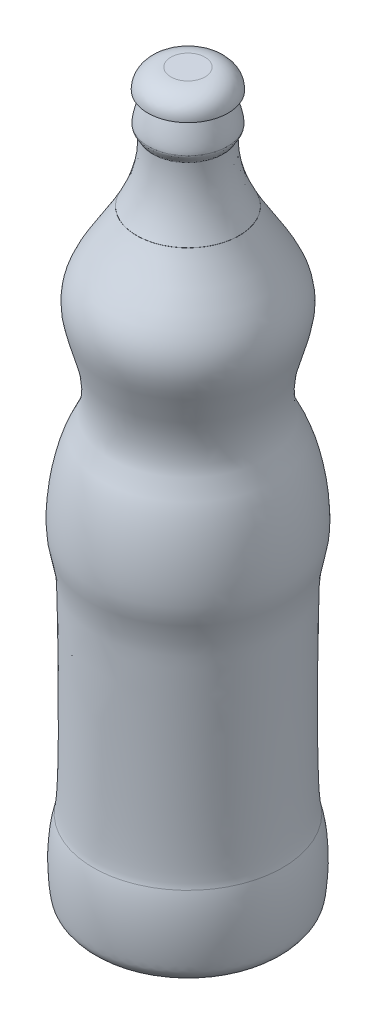
ISO-10303-21;
HEADER;
FILE_DESCRIPTION(('STEP AP214'),'2;1');
FILE_NAME('part.step','',(''),(''),'','','');
FILE_SCHEMA(('AUTOMOTIVE_DESIGN { 1 0 10303 214 1 1 1 1 }'));
ENDSEC;
DATA;
#1=APPLICATION_CONTEXT('core data for automotive mechanical design processes');
#2=APPLICATION_PROTOCOL_DEFINITION('international standard','automotive_design',2000,#1);
#3=PRODUCT_CONTEXT('',#1,'mechanical');
#4=PRODUCT('Part','Part','',(#3));
#5=PRODUCT_RELATED_PRODUCT_CATEGORY('part','',(#4));
#6=PRODUCT_DEFINITION_FORMATION('','',#4);
#7=PRODUCT_DEFINITION_CONTEXT('part definition',#1,'design');
#8=PRODUCT_DEFINITION('design','',#6,#7);
#9=PRODUCT_DEFINITION_SHAPE('','',#8);
#10=(LENGTH_UNIT() NAMED_UNIT(*) SI_UNIT(.MILLI.,.METRE.));
#11=(NAMED_UNIT(*) PLANE_ANGLE_UNIT() SI_UNIT($,.RADIAN.));
#12=(NAMED_UNIT(*) SI_UNIT($,.STERADIAN.) SOLID_ANGLE_UNIT());
#13=UNCERTAINTY_MEASURE_WITH_UNIT(LENGTH_MEASURE(1.E-05),#10,'distance_accuracy_value','');
#14=(GEOMETRIC_REPRESENTATION_CONTEXT(3) GLOBAL_UNCERTAINTY_ASSIGNED_CONTEXT((#13)) GLOBAL_UNIT_ASSIGNED_CONTEXT((#10,
#11,#12)) REPRESENTATION_CONTEXT('',''));
#15=CARTESIAN_POINT('',(0.,0.,0.));
#16=DIRECTION('',(0.,0.,1.));
#17=DIRECTION('',(1.,0.,0.));
#18=AXIS2_PLACEMENT_3D('',#15,#16,#17);
#19=CARTESIAN_POINT('',(103.437061028295,13.3668505112228,0.));
#20=CARTESIAN_POINT('',(103.869440112776,14.9984044111545,0.));
#21=CARTESIAN_POINT('',(103.778336377907,26.9874902235972,0.));
#22=CARTESIAN_POINT('',(103.593499003181,36.4013838784465,0.));
#23=CARTESIAN_POINT('',(102.930574162267,38.5071816998238,0.));
#24=CARTESIAN_POINT('',(102.680629123749,42.1404327930618,0.));
#25=CARTESIAN_POINT('',(103.430431275056,47.0495712206631,0.));
#26=CARTESIAN_POINT('',(105.683429053483,50.9744653208949,0.));
#27=CARTESIAN_POINT('',(105.521768116432,55.5153470128348,0.));
#28=CARTESIAN_POINT('',(103.694260146921,59.2756225317444,0.));
#29=CARTESIAN_POINT('',(104.488200260425,65.6721101762514,0.));
#30=CARTESIAN_POINT('',(109.78947079137,69.6576525002999,0.));
#31=CARTESIAN_POINT('',(109.789470791369,76.1959812911771,0.));
#32=B_SPLINE_CURVE_WITH_KNOTS('',3,(#19,#20,#21,#22,#23,#24,#25,#26,#27,#28,#29,#30,#31),
.UNSPECIFIED.,.F.,.F.,(4,1,1,1,1,1,1,1,1,1,4),(0.,0.369590929952673,0.41673715799568,
0.465381711270695,0.487047864890165,0.611732540570913,0.633988469908386,0.694021573804796,
0.784831209147825,0.815429051767345,1.),.UNSPECIFIED.);
#33=CARTESIAN_POINT('',(113.550027708383,35.303469337613,0.));
#34=DIRECTION('',(0.,-1.,0.));
#35=AXIS1_PLACEMENT('',#33,#34);
#36=SURFACE_OF_REVOLUTION('',#32,#35);
#37=CARTESIAN_POINT('',(113.550027708383,76.1959812911771,0.));
#38=DIRECTION('',(0.,-1.,0.));
#39=DIRECTION('',(0.,0.,-1.));
#40=AXIS2_PLACEMENT_3D('',#37,#38,#39);
#41=CIRCLE('',#40,3.76055691701371);
#42=CARTESIAN_POINT('',(113.550027708383,76.1959812911771,-3.76055691701371));
#43=VERTEX_POINT('',#42);
#44=EDGE_CURVE('E73',#43,#43,#41,.T.);
#45=ORIENTED_EDGE('',*,*,#44,.T.);
#46=EDGE_LOOP('',(#45));
#47=FACE_BOUND('',#46,.T.);
#48=CARTESIAN_POINT('',(113.550027708383,69.5325146345333,0.));
#49=DIRECTION('',(0.,-1.,0.));
#50=DIRECTION('',(0.,0.,-1.));
#51=AXIS2_PLACEMENT_3D('',#48,#49,#50);
#52=CIRCLE('',#51,5.47574976418011);
#53=CARTESIAN_POINT('',(113.550027708383,69.5325146345333,-5.47574976418011));
#54=VERTEX_POINT('',#53);
#55=EDGE_CURVE('E76',#54,#54,#52,.F.);
#56=ORIENTED_EDGE('',*,*,#55,.T.);
#57=EDGE_LOOP('',(#56));
#58=FACE_BOUND('',#57,.T.);
#59=ADVANCED_FACE('F55',(#47,#58),#36,.F.);
#60=CARTESIAN_POINT('',(0.,82.3822992312724,0.));
#61=DIRECTION('',(0.,1.,0.));
#62=DIRECTION('',(0.,0.,1.));
#63=AXIS2_PLACEMENT_3D('',#60,#61,#62);
#64=PLANE('',#63);
#65=CARTESIAN_POINT('',(113.550027708383,82.3822992312724,0.));
#66=DIRECTION('',(0.,-1.,0.));
#67=DIRECTION('',(0.,0.,-1.));
#68=AXIS2_PLACEMENT_3D('',#65,#66,#67);
#69=CIRCLE('',#68,1.82746017712372);
#70=CARTESIAN_POINT('',(113.550027708383,82.3822992312724,-1.82746017712372));
#71=VERTEX_POINT('',#70);
#72=EDGE_CURVE('E112',#71,#71,#69,.T.);
#73=ORIENTED_EDGE('',*,*,#72,.F.);
#74=EDGE_LOOP('',(#73));
#75=FACE_BOUND('',#74,.T.);
#76=ADVANCED_FACE('F101',(#75),#64,.T.);
#77=CARTESIAN_POINT('',(111.722567531259,82.3822992312724,0.));
#78=CARTESIAN_POINT('',(110.468383426424,82.3822992312724,0.));
#79=CARTESIAN_POINT('',(109.262362441948,81.645946560864,0.));
#80=CARTESIAN_POINT('',(109.262362441948,80.2653667988447,0.));
#81=B_SPLINE_CURVE_WITH_KNOTS('',3,(#77,#78,#79,#80),.UNSPECIFIED.,.F.,.F.,(4,4),(0.,1.),.UNSPECIFIED.);
#82=CARTESIAN_POINT('',(113.550027708383,35.303469337613,0.));
#83=DIRECTION('',(0.,-1.,0.));
#84=AXIS1_PLACEMENT('',#82,#83);
#85=SURFACE_OF_REVOLUTION('',#81,#84);
#86=CARTESIAN_POINT('',(113.550027708383,80.2653667988447,0.));
#87=DIRECTION('',(0.,-1.,0.));
#88=DIRECTION('',(0.,0.,-1.));
#89=AXIS2_PLACEMENT_3D('',#86,#87,#88);
#90=CIRCLE('',#89,4.2876652664352);
#91=CARTESIAN_POINT('',(113.550027708383,80.2653667988447,-4.2876652664352));
#92=VERTEX_POINT('',#91);
#93=EDGE_CURVE('E69',#92,#92,#90,.T.);
#94=ORIENTED_EDGE('',*,*,#93,.F.);
#95=EDGE_LOOP('',(#94));
#96=FACE_BOUND('',#95,.T.);
#97=ORIENTED_EDGE('',*,*,#72,.T.);
#98=EDGE_LOOP('',(#97));
#99=FACE_BOUND('',#98,.T.);
#100=ADVANCED_FACE('F106',(#96,#99),#85,.T.);
#101=CARTESIAN_POINT('',(0.,80.2653667988447,0.));
#102=DIRECTION('',(0.,1.,0.));
#103=DIRECTION('',(0.,0.,1.));
#104=AXIS2_PLACEMENT_3D('',#101,#102,#103);
#105=PLANE('',#104);
#106=CARTESIAN_POINT('',(113.550027708383,80.2653667988447,0.));
#107=DIRECTION('',(0.,-1.,0.));
#108=DIRECTION('',(0.,0.,-1.));
#109=AXIS2_PLACEMENT_3D('',#106,#107,#108);
#110=CIRCLE('',#109,3.39744616580165);
#111=CARTESIAN_POINT('',(113.550027708383,80.2653667988447,-3.39744616580165));
#112=VERTEX_POINT('',#111);
#113=EDGE_CURVE('E64',#112,#112,#110,.T.);
#114=ORIENTED_EDGE('',*,*,#113,.F.);
#115=EDGE_LOOP('',(#114));
#116=FACE_BOUND('',#115,.T.);
#117=ORIENTED_EDGE('',*,*,#93,.T.);
#118=EDGE_LOOP('',(#117));
#119=FACE_BOUND('',#118,.T.);
#120=ADVANCED_FACE('F119',(#116,#119),#105,.F.);
#121=CARTESIAN_POINT('',(109.312746851154,77.1642688744141,0.));
#122=CARTESIAN_POINT('',(109.312746851154,77.991036533119,0.));
#123=CARTESIAN_POINT('',(110.152581542581,80.2653667988447,0.));
#124=B_SPLINE_CURVE_WITH_KNOTS('',2,(#121,#122,#123),.UNSPECIFIED.,.F.,.F.,(3,3),(0.,1.),.UNSPECIFIED.);
#125=CARTESIAN_POINT('',(113.550027708383,35.303469337613,0.));
#126=DIRECTION('',(0.,-1.,0.));
#127=AXIS1_PLACEMENT('',#125,#126);
#128=SURFACE_OF_REVOLUTION('',#124,#127);
#129=ORIENTED_EDGE('',*,*,#113,.T.);
#130=EDGE_LOOP('',(#129));
#131=FACE_BOUND('',#130,.T.);
#132=CARTESIAN_POINT('',(113.550027708383,77.1642688744141,0.));
#133=DIRECTION('',(0.,-1.,0.));
#134=DIRECTION('',(0.,0.,-1.));
#135=AXIS2_PLACEMENT_3D('',#132,#133,#134);
#136=CIRCLE('',#135,4.23728085722903);
#137=CARTESIAN_POINT('',(113.550027708383,77.1642688744141,-4.23728085722903));
#138=VERTEX_POINT('',#137);
#139=EDGE_CURVE('E11',#138,#138,#136,.T.);
#140=ORIENTED_EDGE('',*,*,#139,.F.);
#141=EDGE_LOOP('',(#140));
#142=FACE_BOUND('',#141,.T.);
#143=ADVANCED_FACE('F92',(#131,#142),#128,.F.);
#144=CARTESIAN_POINT('',(109.312746851154,77.1642688744141,0.));
#145=CARTESIAN_POINT('',(109.312746851154,76.8530544577516,0.));
#146=CARTESIAN_POINT('',(109.789470791369,76.3232254805346,0.));
#147=CARTESIAN_POINT('',(109.789470791369,76.1959812911767,0.));
#148=B_SPLINE_CURVE_WITH_KNOTS('',3,(#144,#145,#146,#147),.UNSPECIFIED.,.F.,.F.,(4,4),(0.,1.),.UNSPECIFIED.);
#149=CARTESIAN_POINT('',(113.550027708383,35.303469337613,0.));
#150=DIRECTION('',(0.,-1.,0.));
#151=AXIS1_PLACEMENT('',#149,#150);
#152=SURFACE_OF_REVOLUTION('',#148,#151);
#153=ORIENTED_EDGE('',*,*,#44,.F.);
#154=EDGE_LOOP('',(#153));
#155=FACE_BOUND('',#154,.T.);
#156=ORIENTED_EDGE('',*,*,#139,.T.);
#157=EDGE_LOOP('',(#156));
#158=FACE_BOUND('',#157,.T.);
#159=ADVANCED_FACE('F88',(#155,#158),#152,.T.);
#160=CARTESIAN_POINT('',(113.550027708383,69.5325146345334,0.));
#161=DIRECTION('',(0.,-1.,0.));
#162=DIRECTION('',(0.,0.,-1.));
#163=AXIS2_PLACEMENT_3D('',#160,#161,#162);
#164=PLANE('',#163);
#165=ORIENTED_EDGE('',*,*,#55,.F.);
#166=EDGE_LOOP('',(#165));
#167=FACE_BOUND('',#166,.T.);
#168=ADVANCED_FACE('F91',(#167),#164,.T.);
#169=CLOSED_SHELL('',(#59,#76,#100,#120,#143,#159,#168));
#170=MANIFOLD_SOLID_BREP('B2',#169);
#171=CARTESIAN_POINT('',(113.550027708383,4.9225146345334,0.));
#172=DIRECTION('',(0.,-1.,0.));
#173=DIRECTION('',(0.,0.,-1.));
#174=AXIS2_PLACEMENT_3D('',#171,#172,#173);
#175=PLANE('',#174);
#176=CARTESIAN_POINT('',(113.550027708383,4.9225146345334,0.));
#177=DIRECTION('',(0.,-1.,0.));
#178=DIRECTION('',(0.,0.,-1.));
#179=AXIS2_PLACEMENT_3D('',#176,#177,#178);
#180=CIRCLE('',#179,0.499999999999999);
#181=CARTESIAN_POINT('',(113.550027708383,4.9225146345334,-0.499999999999999));
#182=VERTEX_POINT('',#181);
#183=EDGE_CURVE('E239',#182,#182,#180,.T.);
#184=ORIENTED_EDGE('',*,*,#183,.T.);
#185=EDGE_LOOP('',(#184));
#186=FACE_BOUND('',#185,.T.);
#187=ADVANCED_FACE('F226',(#186),#175,.T.);
#188=CARTESIAN_POINT('',(113.550027708383,4.9225146345334,0.));
#189=DIRECTION('',(0.,-1.,0.));
#190=DIRECTION('',(0.,0.,-1.));
#191=AXIS2_PLACEMENT_3D('',#188,#189,#190);
#192=CYLINDRICAL_SURFACE('',#191,0.499999999999999);
#193=ORIENTED_EDGE('',*,*,#183,.F.);
#194=EDGE_LOOP('',(#193));
#195=FACE_BOUND('',#194,.T.);
#196=CARTESIAN_POINT('',(113.550027708383,4.5225146345334,0.));
#197=DIRECTION('',(0.,-1.,0.));
#198=DIRECTION('',(0.,0.,-1.));
#199=AXIS2_PLACEMENT_3D('',#196,#197,#198);
#200=CIRCLE('',#199,0.499999999999999);
#201=CARTESIAN_POINT('',(113.550027708383,4.5225146345334,-0.499999999999999));
#202=VERTEX_POINT('',#201);
#203=EDGE_CURVE('E276',#202,#202,#200,.T.);
#204=ORIENTED_EDGE('',*,*,#203,.T.);
#205=EDGE_LOOP('',(#204));
#206=FACE_BOUND('',#205,.T.);
#207=ADVANCED_FACE('F258',(#195,#206),#192,.F.);
#208=CARTESIAN_POINT('',(0.,4.5225146345334,0.));
#209=DIRECTION('',(0.,1.,0.));
#210=DIRECTION('',(0.,0.,1.));
#211=AXIS2_PLACEMENT_3D('',#208,#209,#210);
#212=PLANE('',#211);
#213=ORIENTED_EDGE('',*,*,#203,.F.);
#214=EDGE_LOOP('',(#213));
#215=FACE_BOUND('',#214,.T.);
#216=CARTESIAN_POINT('',(113.550027708383,4.5225146345334,0.));
#217=DIRECTION('',(0.,-1.,0.));
#218=DIRECTION('',(0.,0.,-1.));
#219=AXIS2_PLACEMENT_3D('',#216,#217,#218);
#220=CIRCLE('',#219,8.51949676772999);
#221=CARTESIAN_POINT('',(113.550027708383,4.5225146345334,-8.51949676772999));
#222=VERTEX_POINT('',#221);
#223=EDGE_CURVE('E235',#222,#222,#220,.T.);
#224=ORIENTED_EDGE('',*,*,#223,.T.);
#225=EDGE_LOOP('',(#224));
#226=FACE_BOUND('',#225,.T.);
#227=ADVANCED_FACE('F255',(#215,#226),#212,.F.);
#228=CARTESIAN_POINT('',(105.030530940653,4.5225146345334,0.));
#229=CARTESIAN_POINT('',(104.064646420814,4.5225146345334,0.));
#230=CARTESIAN_POINT('',(103.383244839197,5.41026998034948,0.));
#231=CARTESIAN_POINT('',(103.087737997372,6.27419093909465,0.));
#232=CARTESIAN_POINT('',(102.660689225434,10.437262822499,0.));
#233=CARTESIAN_POINT('',(103.437061028295,13.3668505112228,0.));
#234=B_SPLINE_CURVE_WITH_KNOTS('',3,(#228,#229,#230,#231,#232,#233),.UNSPECIFIED.,.F.,.F.,(4,1,
1,4),(0.,0.208168804237619,0.249427648620568,0.412588443829493),.UNSPECIFIED.);
#235=CARTESIAN_POINT('',(113.550027708383,35.303469337613,0.));
#236=DIRECTION('',(0.,-1.,0.));
#237=AXIS1_PLACEMENT('',#235,#236);
#238=SURFACE_OF_REVOLUTION('',#234,#237);
#239=CARTESIAN_POINT('',(113.550027708383,13.3668505112228,0.));
#240=DIRECTION('',(0.,-1.,0.));
#241=DIRECTION('',(0.,0.,-1.));
#242=AXIS2_PLACEMENT_3D('',#239,#240,#241);
#243=CIRCLE('',#242,10.1129666800877);
#244=CARTESIAN_POINT('',(113.550027708383,13.3668505112228,-10.1129666800877));
#245=VERTEX_POINT('',#244);
#246=EDGE_CURVE('E54',#245,#245,#243,.T.);
#247=ORIENTED_EDGE('',*,*,#246,.T.);
#248=EDGE_LOOP('',(#247));
#249=FACE_BOUND('',#248,.T.);
#250=ORIENTED_EDGE('',*,*,#223,.F.);
#251=EDGE_LOOP('',(#250));
#252=FACE_BOUND('',#251,.T.);
#253=ADVANCED_FACE('F252',(#249,#252),#238,.F.);
#254=CARTESIAN_POINT('',(103.437061028295,13.3668505112228,0.));
#255=CARTESIAN_POINT('',(103.869440112776,14.9984044111545,0.));
#256=CARTESIAN_POINT('',(103.778336377907,26.9874902235972,0.));
#257=CARTESIAN_POINT('',(103.593499003181,36.4013838784465,0.));
#258=CARTESIAN_POINT('',(102.930574162267,38.5071816998238,0.));
#259=CARTESIAN_POINT('',(102.680629123749,42.1404327930618,0.));
#260=CARTESIAN_POINT('',(103.430431275056,47.0495712206631,0.));
#261=CARTESIAN_POINT('',(105.683429053483,50.9744653208949,0.));
#262=CARTESIAN_POINT('',(105.521768116432,55.5153470128348,0.));
#263=CARTESIAN_POINT('',(103.694260146921,59.2756225317444,0.));
#264=CARTESIAN_POINT('',(104.488200260425,65.6721101762514,0.));
#265=CARTESIAN_POINT('',(109.78947079137,69.6576525002999,0.));
#266=CARTESIAN_POINT('',(109.789470791369,76.1959812911771,0.));
#267=B_SPLINE_CURVE_WITH_KNOTS('',3,(#254,#255,#256,#257,#258,#259,#260,#261,#262,#263,#264,
#265,#266),.UNSPECIFIED.,.F.,.F.,(4,1,1,1,1,1,1,1,1,1,4),(0.,0.369590929952673,0.41673715799568,
0.465381711270695,0.487047864890165,0.611732540570913,0.633988469908386,0.694021573804796,
0.784831209147825,0.815429051767345,1.),.UNSPECIFIED.);
#268=CARTESIAN_POINT('',(113.550027708383,35.303469337613,0.));
#269=DIRECTION('',(0.,-1.,0.));
#270=AXIS1_PLACEMENT('',#268,#269);
#271=SURFACE_OF_REVOLUTION('',#267,#270);
#272=CARTESIAN_POINT('',(113.550027708383,69.5225146345333,0.));
#273=DIRECTION('',(0.,-1.,0.));
#274=DIRECTION('',(0.,0.,-1.));
#275=AXIS2_PLACEMENT_3D('',#272,#273,#274);
#276=CIRCLE('',#275,5.48092666167881);
#277=CARTESIAN_POINT('',(113.550027708383,69.5225146345333,-5.48092666167881));
#278=VERTEX_POINT('',#277);
#279=EDGE_CURVE('E231',#278,#278,#276,.F.);
#280=ORIENTED_EDGE('',*,*,#279,.F.);
#281=EDGE_LOOP('',(#280));
#282=FACE_BOUND('',#281,.T.);
#283=ORIENTED_EDGE('',*,*,#246,.F.);
#284=EDGE_LOOP('',(#283));
#285=FACE_BOUND('',#284,.T.);
#286=ADVANCED_FACE('F228',(#282,#285),#271,.F.);
#287=CARTESIAN_POINT('',(113.550027708383,69.5225146345334,0.));
#288=DIRECTION('',(0.,-1.,0.));
#289=DIRECTION('',(0.,0.,-1.));
#290=AXIS2_PLACEMENT_3D('',#287,#288,#289);
#291=PLANE('',#290);
#292=ORIENTED_EDGE('',*,*,#279,.T.);
#293=EDGE_LOOP('',(#292));
#294=FACE_BOUND('',#293,.T.);
#295=ADVANCED_FACE('F266',(#294),#291,.F.);
#296=CLOSED_SHELL('',(#187,#207,#227,#253,#286,#295));
#297=MANIFOLD_SOLID_BREP('B6',#296);
#298=ADVANCED_BREP_SHAPE_REPRESENTATION('',(#18,#170,#297),#14);
#299=SHAPE_DEFINITION_REPRESENTATION(#9,#298);
ENDSEC;
END-ISO-10303-21;
